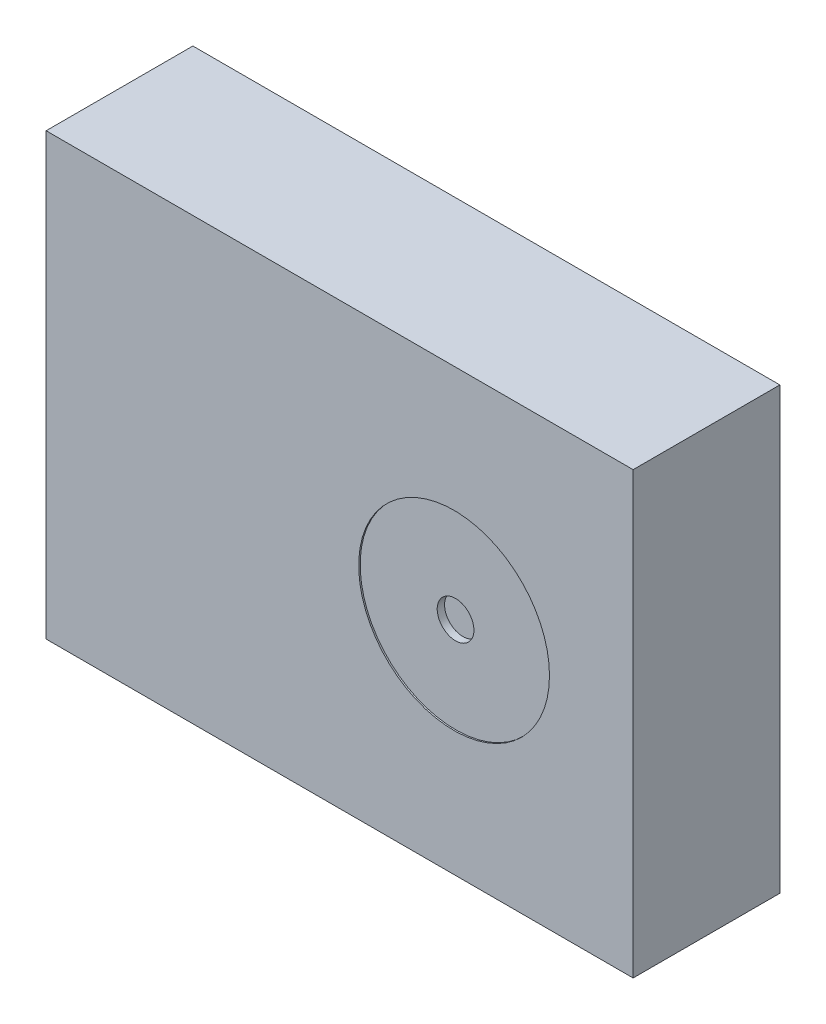
ISO-10303-21;
HEADER;
FILE_DESCRIPTION(('STEP AP214'),'2;1');
FILE_NAME('part.step','',(''),(''),'','','');
FILE_SCHEMA(('AUTOMOTIVE_DESIGN { 1 0 10303 214 1 1 1 1 }'));
ENDSEC;
DATA;
#1=APPLICATION_CONTEXT('core data for automotive mechanical design processes');
#2=APPLICATION_PROTOCOL_DEFINITION('international standard','automotive_design',2000,#1);
#3=PRODUCT_CONTEXT('',#1,'mechanical');
#4=PRODUCT('Part','Part','',(#3));
#5=PRODUCT_RELATED_PRODUCT_CATEGORY('part','',(#4));
#6=PRODUCT_DEFINITION_FORMATION('','',#4);
#7=PRODUCT_DEFINITION_CONTEXT('part definition',#1,'design');
#8=PRODUCT_DEFINITION('design','',#6,#7);
#9=PRODUCT_DEFINITION_SHAPE('','',#8);
#10=(LENGTH_UNIT() NAMED_UNIT(*) SI_UNIT(.MILLI.,.METRE.));
#11=(NAMED_UNIT(*) PLANE_ANGLE_UNIT() SI_UNIT($,.RADIAN.));
#12=(NAMED_UNIT(*) SI_UNIT($,.STERADIAN.) SOLID_ANGLE_UNIT());
#13=UNCERTAINTY_MEASURE_WITH_UNIT(LENGTH_MEASURE(1.E-05),#10,'distance_accuracy_value','');
#14=(GEOMETRIC_REPRESENTATION_CONTEXT(3) GLOBAL_UNCERTAINTY_ASSIGNED_CONTEXT((#13)) GLOBAL_UNIT_ASSIGNED_CONTEXT((#10,
#11,#12)) REPRESENTATION_CONTEXT('',''));
#15=CARTESIAN_POINT('',(0.,0.,0.));
#16=DIRECTION('',(0.,0.,1.));
#17=DIRECTION('',(1.,0.,0.));
#18=AXIS2_PLACEMENT_3D('',#15,#16,#17);
#19=CARTESIAN_POINT('',(0.78,0.,0.94));
#20=DIRECTION('',(0.,0.,1.));
#21=DIRECTION('',(1.,0.,0.));
#22=AXIS2_PLACEMENT_3D('',#19,#20,#21);
#23=PLANE('',#22);
#24=CARTESIAN_POINT('',(0.78,0.,0.94));
#25=DIRECTION('',(0.,0.,1.));
#26=DIRECTION('',(1.,0.,0.));
#27=AXIS2_PLACEMENT_3D('',#24,#25,#26);
#28=CIRCLE('',#27,0.125);
#29=CARTESIAN_POINT('',(0.905,0.,0.94));
#30=VERTEX_POINT('',#29);
#31=EDGE_CURVE('E20',#30,#30,#28,.T.);
#32=ORIENTED_EDGE('',*,*,#31,.T.);
#33=EDGE_LOOP('',(#32));
#34=FACE_BOUND('',#33,.T.);
#35=ADVANCED_FACE('F17',(#34),#23,.T.);
#36=CARTESIAN_POINT('',(0.,0.,0.));
#37=DIRECTION('',(0.,0.,1.));
#38=DIRECTION('',(1.,0.,0.));
#39=AXIS2_PLACEMENT_3D('',#36,#37,#38);
#40=PLANE('',#39);
#41=DIRECTION('',(1.,0.,0.));
#42=VECTOR('',#41,1.);
#43=CARTESIAN_POINT('',(-2.,1.5,0.));
#44=LINE('',#43,#42);
#45=CARTESIAN_POINT('',(-2.,1.5,0.));
#46=VERTEX_POINT('',#45);
#47=CARTESIAN_POINT('',(2.,1.5,0.));
#48=VERTEX_POINT('',#47);
#49=EDGE_CURVE('E88',#46,#48,#44,.T.);
#50=ORIENTED_EDGE('',*,*,#49,.T.);
#51=DIRECTION('',(0.,1.,0.));
#52=VECTOR('',#51,1.);
#53=CARTESIAN_POINT('',(2.,1.5,0.));
#54=LINE('',#53,#52);
#55=CARTESIAN_POINT('',(2.,-1.5,0.));
#56=VERTEX_POINT('',#55);
#57=EDGE_CURVE('E75',#48,#56,#54,.F.);
#58=ORIENTED_EDGE('',*,*,#57,.T.);
#59=DIRECTION('',(1.,0.,0.));
#60=VECTOR('',#59,1.);
#61=CARTESIAN_POINT('',(-2.,-1.5,0.));
#62=LINE('',#61,#60);
#63=CARTESIAN_POINT('',(-2.,-1.5,0.));
#64=VERTEX_POINT('',#63);
#65=EDGE_CURVE('E61',#56,#64,#62,.F.);
#66=ORIENTED_EDGE('',*,*,#65,.T.);
#67=DIRECTION('',(0.,1.,0.));
#68=VECTOR('',#67,1.);
#69=CARTESIAN_POINT('',(-2.,1.5,0.));
#70=LINE('',#69,#68);
#71=EDGE_CURVE('E73',#64,#46,#70,.T.);
#72=ORIENTED_EDGE('',*,*,#71,.T.);
#73=EDGE_LOOP('',(#50,#58,#66,#72));
#74=FACE_BOUND('',#73,.T.);
#75=ADVANCED_FACE('F72',(#74),#40,.F.);
#76=CARTESIAN_POINT('',(0.78,0.,0.94));
#77=DIRECTION('',(0.,0.,1.));
#78=DIRECTION('',(1.,0.,0.));
#79=AXIS2_PLACEMENT_3D('',#76,#77,#78);
#80=CYLINDRICAL_SURFACE('',#79,0.125);
#81=CARTESIAN_POINT('',(0.78,0.,0.99));
#82=DIRECTION('',(0.,0.,1.));
#83=DIRECTION('',(1.,0.,0.));
#84=AXIS2_PLACEMENT_3D('',#81,#82,#83);
#85=CIRCLE('',#84,0.125);
#86=CARTESIAN_POINT('',(0.905,0.,0.99));
#87=VERTEX_POINT('',#86);
#88=EDGE_CURVE('E67',#87,#87,#85,.F.);
#89=ORIENTED_EDGE('',*,*,#88,.F.);
#90=EDGE_LOOP('',(#89));
#91=FACE_BOUND('',#90,.T.);
#92=ORIENTED_EDGE('',*,*,#31,.F.);
#93=EDGE_LOOP('',(#92));
#94=FACE_BOUND('',#93,.T.);
#95=ADVANCED_FACE('F129',(#91,#94),#80,.F.);
#96=CARTESIAN_POINT('',(0.78,0.,0.99));
#97=DIRECTION('',(0.,0.,1.));
#98=DIRECTION('',(1.,0.,0.));
#99=AXIS2_PLACEMENT_3D('',#96,#97,#98);
#100=PLANE('',#99);
#101=CARTESIAN_POINT('',(0.78,0.,0.99));
#102=DIRECTION('',(0.,0.,1.));
#103=DIRECTION('',(1.,0.,0.));
#104=AXIS2_PLACEMENT_3D('',#101,#102,#103);
#105=CIRCLE('',#104,0.65);
#106=CARTESIAN_POINT('',(1.43,0.,0.99));
#107=VERTEX_POINT('',#106);
#108=EDGE_CURVE('E84',#107,#107,#105,.T.);
#109=ORIENTED_EDGE('',*,*,#108,.T.);
#110=EDGE_LOOP('',(#109));
#111=FACE_BOUND('',#110,.T.);
#112=ORIENTED_EDGE('',*,*,#88,.T.);
#113=EDGE_LOOP('',(#112));
#114=FACE_BOUND('',#113,.T.);
#115=ADVANCED_FACE('F127',(#111,#114),#100,.T.);
#116=CARTESIAN_POINT('',(-2.,1.5,1.));
#117=DIRECTION('',(1.,0.,0.));
#118=DIRECTION('',(0.,0.,-1.));
#119=AXIS2_PLACEMENT_3D('',#116,#117,#118);
#120=PLANE('',#119);
#121=ORIENTED_EDGE('',*,*,#71,.F.);
#122=DIRECTION('',(0.,0.,1.));
#123=VECTOR('',#122,1.);
#124=CARTESIAN_POINT('',(-2.,-1.5,1.));
#125=LINE('',#124,#123);
#126=CARTESIAN_POINT('',(-2.,-1.5,1.));
#127=VERTEX_POINT('',#126);
#128=EDGE_CURVE('E58',#64,#127,#125,.T.);
#129=ORIENTED_EDGE('',*,*,#128,.T.);
#130=DIRECTION('',(0.,1.,0.));
#131=VECTOR('',#130,1.);
#132=CARTESIAN_POINT('',(-2.,0.,1.));
#133=LINE('',#132,#131);
#134=CARTESIAN_POINT('',(-2.,1.5,1.));
#135=VERTEX_POINT('',#134);
#136=EDGE_CURVE('E86',#135,#127,#133,.F.);
#137=ORIENTED_EDGE('',*,*,#136,.F.);
#138=DIRECTION('',(0.,0.,-1.));
#139=VECTOR('',#138,1.);
#140=CARTESIAN_POINT('',(-2.,1.5,1.));
#141=LINE('',#140,#139);
#142=EDGE_CURVE('E79',#135,#46,#141,.T.);
#143=ORIENTED_EDGE('',*,*,#142,.T.);
#144=EDGE_LOOP('',(#121,#129,#137,#143));
#145=FACE_BOUND('',#144,.T.);
#146=ADVANCED_FACE('F77',(#145),#120,.F.);
#147=CARTESIAN_POINT('',(-2.,-1.5,1.));
#148=DIRECTION('',(0.,1.,0.));
#149=DIRECTION('',(0.,0.,1.));
#150=AXIS2_PLACEMENT_3D('',#147,#148,#149);
#151=PLANE('',#150);
#152=ORIENTED_EDGE('',*,*,#65,.F.);
#153=DIRECTION('',(0.,0.,1.));
#154=VECTOR('',#153,1.);
#155=CARTESIAN_POINT('',(2.,-1.5,1.));
#156=LINE('',#155,#154);
#157=CARTESIAN_POINT('',(2.,-1.5,1.));
#158=VERTEX_POINT('',#157);
#159=EDGE_CURVE('E52',#56,#158,#156,.T.);
#160=ORIENTED_EDGE('',*,*,#159,.T.);
#161=DIRECTION('',(1.,0.,0.));
#162=VECTOR('',#161,1.);
#163=CARTESIAN_POINT('',(0.,-1.5,1.));
#164=LINE('',#163,#162);
#165=EDGE_CURVE('E63',#127,#158,#164,.T.);
#166=ORIENTED_EDGE('',*,*,#165,.F.);
#167=ORIENTED_EDGE('',*,*,#128,.F.);
#168=EDGE_LOOP('',(#152,#160,#166,#167));
#169=FACE_BOUND('',#168,.T.);
#170=ADVANCED_FACE('F60',(#169),#151,.F.);
#171=CARTESIAN_POINT('',(2.,1.5,1.));
#172=DIRECTION('',(-1.,0.,0.));
#173=DIRECTION('',(0.,0.,1.));
#174=AXIS2_PLACEMENT_3D('',#171,#172,#173);
#175=PLANE('',#174);
#176=ORIENTED_EDGE('',*,*,#159,.F.);
#177=ORIENTED_EDGE('',*,*,#57,.F.);
#178=DIRECTION('',(0.,0.,-1.));
#179=VECTOR('',#178,1.);
#180=CARTESIAN_POINT('',(2.,1.5,1.));
#181=LINE('',#180,#179);
#182=CARTESIAN_POINT('',(2.,1.5,1.));
#183=VERTEX_POINT('',#182);
#184=EDGE_CURVE('E35',#48,#183,#181,.F.);
#185=ORIENTED_EDGE('',*,*,#184,.T.);
#186=DIRECTION('',(0.,1.,0.));
#187=VECTOR('',#186,1.);
#188=CARTESIAN_POINT('',(2.,0.,1.));
#189=LINE('',#188,#187);
#190=EDGE_CURVE('E98',#158,#183,#189,.T.);
#191=ORIENTED_EDGE('',*,*,#190,.F.);
#192=EDGE_LOOP('',(#176,#177,#185,#191));
#193=FACE_BOUND('',#192,.T.);
#194=ADVANCED_FACE('F108',(#193),#175,.F.);
#195=CARTESIAN_POINT('',(-2.,1.5,1.));
#196=DIRECTION('',(0.,-1.,0.));
#197=DIRECTION('',(0.,0.,-1.));
#198=AXIS2_PLACEMENT_3D('',#195,#196,#197);
#199=PLANE('',#198);
#200=ORIENTED_EDGE('',*,*,#184,.F.);
#201=ORIENTED_EDGE('',*,*,#49,.F.);
#202=ORIENTED_EDGE('',*,*,#142,.F.);
#203=DIRECTION('',(1.,0.,0.));
#204=VECTOR('',#203,1.);
#205=CARTESIAN_POINT('',(0.,1.5,1.));
#206=LINE('',#205,#204);
#207=EDGE_CURVE('E26',#183,#135,#206,.F.);
#208=ORIENTED_EDGE('',*,*,#207,.F.);
#209=EDGE_LOOP('',(#200,#201,#202,#208));
#210=FACE_BOUND('',#209,.T.);
#211=ADVANCED_FACE('F105',(#210),#199,.F.);
#212=CARTESIAN_POINT('',(0.78,0.,0.99));
#213=DIRECTION('',(0.,0.,1.));
#214=DIRECTION('',(1.,0.,0.));
#215=AXIS2_PLACEMENT_3D('',#212,#213,#214);
#216=CYLINDRICAL_SURFACE('',#215,0.65);
#217=CARTESIAN_POINT('',(0.78,0.,1.));
#218=DIRECTION('',(0.,0.,1.));
#219=DIRECTION('',(1.,0.,0.));
#220=AXIS2_PLACEMENT_3D('',#217,#218,#219);
#221=CIRCLE('',#220,0.65);
#222=CARTESIAN_POINT('',(1.43,0.,1.));
#223=VERTEX_POINT('',#222);
#224=EDGE_CURVE('E11',#223,#223,#221,.F.);
#225=ORIENTED_EDGE('',*,*,#224,.F.);
#226=EDGE_LOOP('',(#225));
#227=FACE_BOUND('',#226,.T.);
#228=ORIENTED_EDGE('',*,*,#108,.F.);
#229=EDGE_LOOP('',(#228));
#230=FACE_BOUND('',#229,.T.);
#231=ADVANCED_FACE('F107',(#227,#230),#216,.F.);
#232=CARTESIAN_POINT('',(0.,0.,1.));
#233=DIRECTION('',(0.,0.,1.));
#234=DIRECTION('',(1.,0.,0.));
#235=AXIS2_PLACEMENT_3D('',#232,#233,#234);
#236=PLANE('',#235);
#237=ORIENTED_EDGE('',*,*,#224,.T.);
#238=EDGE_LOOP('',(#237));
#239=FACE_BOUND('',#238,.T.);
#240=ORIENTED_EDGE('',*,*,#190,.T.);
#241=ORIENTED_EDGE('',*,*,#207,.T.);
#242=ORIENTED_EDGE('',*,*,#136,.T.);
#243=ORIENTED_EDGE('',*,*,#165,.T.);
#244=EDGE_LOOP('',(#240,#241,#242,#243));
#245=FACE_BOUND('',#244,.T.);
#246=ADVANCED_FACE('F103',(#239,#245),#236,.T.);
#247=CLOSED_SHELL('',(#35,#75,#95,#115,#146,#170,#194,#211,#231,#246));
#248=MANIFOLD_SOLID_BREP('B1',#247);
#249=ADVANCED_BREP_SHAPE_REPRESENTATION('',(#18,#248),#14);
#250=SHAPE_DEFINITION_REPRESENTATION(#9,#249);
ENDSEC;
END-ISO-10303-21;
